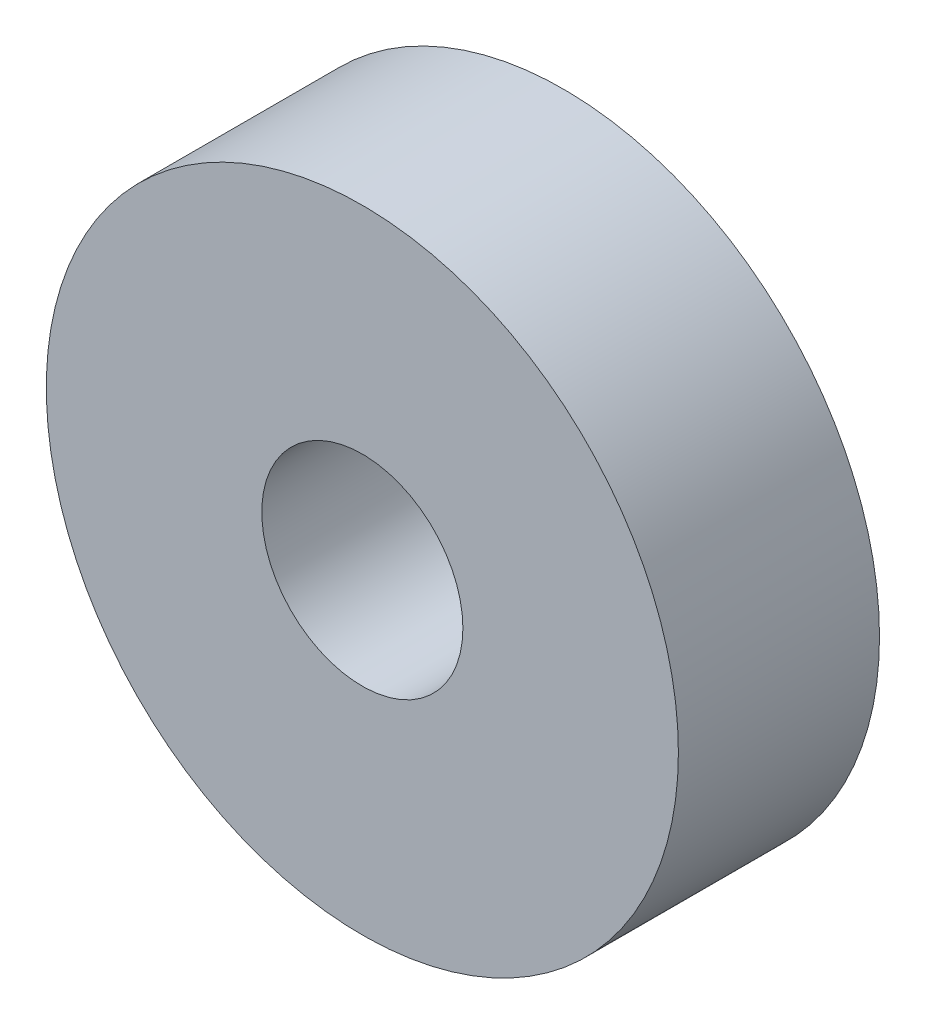
ISO-10303-21;
HEADER;
FILE_DESCRIPTION(('STEP AP214'),'2;1');
FILE_NAME('part.step','',(''),(''),'','','');
FILE_SCHEMA(('AUTOMOTIVE_DESIGN { 1 0 10303 214 1 1 1 1 }'));
ENDSEC;
DATA;
#1=APPLICATION_CONTEXT('core data for automotive mechanical design processes');
#2=APPLICATION_PROTOCOL_DEFINITION('international standard','automotive_design',2000,#1);
#3=PRODUCT_CONTEXT('',#1,'mechanical');
#4=PRODUCT('Part','Part','',(#3));
#5=PRODUCT_RELATED_PRODUCT_CATEGORY('part','',(#4));
#6=PRODUCT_DEFINITION_FORMATION('','',#4);
#7=PRODUCT_DEFINITION_CONTEXT('part definition',#1,'design');
#8=PRODUCT_DEFINITION('design','',#6,#7);
#9=PRODUCT_DEFINITION_SHAPE('','',#8);
#10=(LENGTH_UNIT() NAMED_UNIT(*) SI_UNIT(.MILLI.,.METRE.));
#11=(NAMED_UNIT(*) PLANE_ANGLE_UNIT() SI_UNIT($,.RADIAN.));
#12=(NAMED_UNIT(*) SI_UNIT($,.STERADIAN.) SOLID_ANGLE_UNIT());
#13=UNCERTAINTY_MEASURE_WITH_UNIT(LENGTH_MEASURE(1.E-05),#10,'distance_accuracy_value','');
#14=(GEOMETRIC_REPRESENTATION_CONTEXT(3) GLOBAL_UNCERTAINTY_ASSIGNED_CONTEXT((#13)) GLOBAL_UNIT_ASSIGNED_CONTEXT((#10,
#11,#12)) REPRESENTATION_CONTEXT('',''));
#15=CARTESIAN_POINT('',(0.,0.,0.));
#16=DIRECTION('',(0.,0.,1.));
#17=DIRECTION('',(1.,0.,0.));
#18=AXIS2_PLACEMENT_3D('',#15,#16,#17);
#19=CARTESIAN_POINT('',(0.,0.,3.5));
#20=DIRECTION('',(0.,0.,-1.));
#21=DIRECTION('',(-1.,0.,0.));
#22=AXIS2_PLACEMENT_3D('',#19,#20,#21);
#23=CYLINDRICAL_SURFACE('',#22,11.);
#24=CARTESIAN_POINT('',(0.,0.,3.5));
#25=DIRECTION('',(0.,0.,1.));
#26=DIRECTION('',(1.,0.,0.));
#27=AXIS2_PLACEMENT_3D('',#24,#25,#26);
#28=CIRCLE('',#27,11.);
#29=CARTESIAN_POINT('',(11.,0.,3.5));
#30=VERTEX_POINT('',#29);
#31=EDGE_CURVE('E10',#30,#30,#28,.T.);
#32=ORIENTED_EDGE('',*,*,#31,.F.);
#33=EDGE_LOOP('',(#32));
#34=FACE_BOUND('',#33,.T.);
#35=CARTESIAN_POINT('',(0.,0.,-3.5));
#36=DIRECTION('',(0.,0.,1.));
#37=DIRECTION('',(1.,0.,0.));
#38=AXIS2_PLACEMENT_3D('',#35,#36,#37);
#39=CIRCLE('',#38,11.);
#40=CARTESIAN_POINT('',(11.,0.,-3.5));
#41=VERTEX_POINT('',#40);
#42=EDGE_CURVE('E46',#41,#41,#39,.T.);
#43=ORIENTED_EDGE('',*,*,#42,.T.);
#44=EDGE_LOOP('',(#43));
#45=FACE_BOUND('',#44,.T.);
#46=ADVANCED_FACE('F39',(#34,#45),#23,.T.);
#47=CARTESIAN_POINT('',(0.,0.,3.5));
#48=DIRECTION('',(0.,0.,1.));
#49=DIRECTION('',(1.,0.,0.));
#50=AXIS2_PLACEMENT_3D('',#47,#48,#49);
#51=PLANE('',#50);
#52=CARTESIAN_POINT('',(0.,0.,3.5));
#53=DIRECTION('',(0.,0.,1.));
#54=DIRECTION('',(1.,0.,0.));
#55=AXIS2_PLACEMENT_3D('',#52,#53,#54);
#56=CIRCLE('',#55,3.5);
#57=CARTESIAN_POINT('',(3.5,0.,3.5));
#58=VERTEX_POINT('',#57);
#59=EDGE_CURVE('E51',#58,#58,#56,.F.);
#60=ORIENTED_EDGE('',*,*,#59,.T.);
#61=EDGE_LOOP('',(#60));
#62=FACE_BOUND('',#61,.T.);
#63=ORIENTED_EDGE('',*,*,#31,.T.);
#64=EDGE_LOOP('',(#63));
#65=FACE_BOUND('',#64,.T.);
#66=ADVANCED_FACE('F64',(#62,#65),#51,.T.);
#67=CARTESIAN_POINT('',(0.,0.,-3.5));
#68=DIRECTION('',(0.,0.,1.));
#69=DIRECTION('',(1.,0.,0.));
#70=AXIS2_PLACEMENT_3D('',#67,#68,#69);
#71=PLANE('',#70);
#72=CARTESIAN_POINT('',(0.,0.,-3.5));
#73=DIRECTION('',(0.,0.,1.));
#74=DIRECTION('',(1.,0.,0.));
#75=AXIS2_PLACEMENT_3D('',#72,#73,#74);
#76=CIRCLE('',#75,3.5);
#77=CARTESIAN_POINT('',(3.5,0.,-3.5));
#78=VERTEX_POINT('',#77);
#79=EDGE_CURVE('E42',#78,#78,#76,.F.);
#80=ORIENTED_EDGE('',*,*,#79,.F.);
#81=EDGE_LOOP('',(#80));
#82=FACE_BOUND('',#81,.T.);
#83=ORIENTED_EDGE('',*,*,#42,.F.);
#84=EDGE_LOOP('',(#83));
#85=FACE_BOUND('',#84,.T.);
#86=ADVANCED_FACE('F61',(#82,#85),#71,.F.);
#87=CARTESIAN_POINT('',(0.,0.,4.));
#88=DIRECTION('',(0.,0.,-1.));
#89=DIRECTION('',(-1.,0.,0.));
#90=AXIS2_PLACEMENT_3D('',#87,#88,#89);
#91=CYLINDRICAL_SURFACE('',#90,3.5);
#92=ORIENTED_EDGE('',*,*,#59,.F.);
#93=EDGE_LOOP('',(#92));
#94=FACE_BOUND('',#93,.T.);
#95=ORIENTED_EDGE('',*,*,#79,.T.);
#96=EDGE_LOOP('',(#95));
#97=FACE_BOUND('',#96,.T.);
#98=ADVANCED_FACE('F59',(#94,#97),#91,.F.);
#99=CLOSED_SHELL('',(#46,#66,#86,#98));
#100=MANIFOLD_SOLID_BREP('B2',#99);
#101=ADVANCED_BREP_SHAPE_REPRESENTATION('',(#18,#100),#14);
#102=SHAPE_DEFINITION_REPRESENTATION(#9,#101);
ENDSEC;
END-ISO-10303-21;
